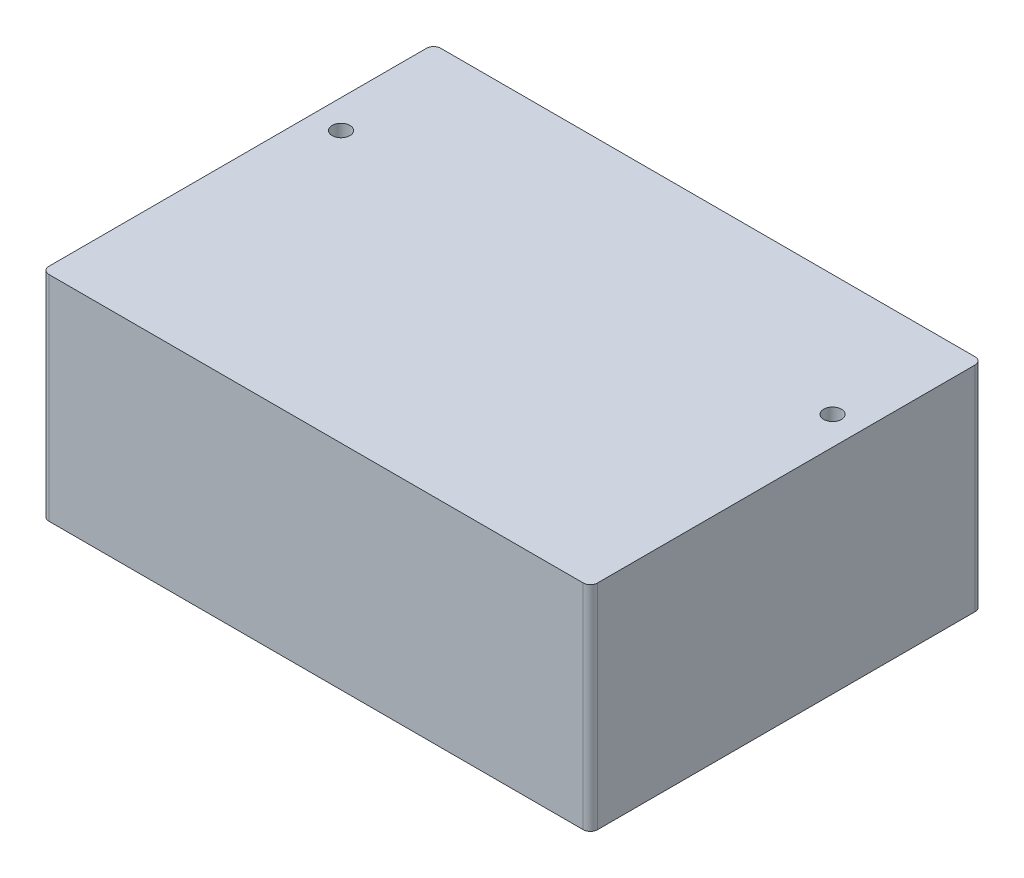
ISO-10303-21;
HEADER;
FILE_DESCRIPTION(('STEP AP214'),'2;1');
FILE_NAME('part.step','',(''),(''),'','','');
FILE_SCHEMA(('AUTOMOTIVE_DESIGN { 1 0 10303 214 1 1 1 1 }'));
ENDSEC;
DATA;
#1=APPLICATION_CONTEXT('core data for automotive mechanical design processes');
#2=APPLICATION_PROTOCOL_DEFINITION('international standard','automotive_design',2000,#1);
#3=PRODUCT_CONTEXT('',#1,'mechanical');
#4=PRODUCT('Part','Part','',(#3));
#5=PRODUCT_RELATED_PRODUCT_CATEGORY('part','',(#4));
#6=PRODUCT_DEFINITION_FORMATION('','',#4);
#7=PRODUCT_DEFINITION_CONTEXT('part definition',#1,'design');
#8=PRODUCT_DEFINITION('design','',#6,#7);
#9=PRODUCT_DEFINITION_SHAPE('','',#8);
#10=(LENGTH_UNIT() NAMED_UNIT(*) SI_UNIT(.MILLI.,.METRE.));
#11=(NAMED_UNIT(*) PLANE_ANGLE_UNIT() SI_UNIT($,.RADIAN.));
#12=(NAMED_UNIT(*) SI_UNIT($,.STERADIAN.) SOLID_ANGLE_UNIT());
#13=UNCERTAINTY_MEASURE_WITH_UNIT(LENGTH_MEASURE(1.E-05),#10,'distance_accuracy_value','');
#14=(GEOMETRIC_REPRESENTATION_CONTEXT(3) GLOBAL_UNCERTAINTY_ASSIGNED_CONTEXT((#13)) GLOBAL_UNIT_ASSIGNED_CONTEXT((#10,
#11,#12)) REPRESENTATION_CONTEXT('',''));
#15=CARTESIAN_POINT('',(0.,0.,0.));
#16=DIRECTION('',(0.,0.,1.));
#17=DIRECTION('',(1.,0.,0.));
#18=AXIS2_PLACEMENT_3D('',#15,#16,#17);
#19=CARTESIAN_POINT('',(0.,30.,0.));
#20=DIRECTION('',(1.,0.,0.));
#21=DIRECTION('',(0.,0.,-1.));
#22=AXIS2_PLACEMENT_3D('',#19,#20,#21);
#23=PLANE('',#22);
#24=DIRECTION('',(0.,0.,1.));
#25=VECTOR('',#24,1.);
#26=CARTESIAN_POINT('',(0.,30.,0.));
#27=LINE('',#26,#25);
#28=CARTESIAN_POINT('',(0.,30.,-54.));
#29=VERTEX_POINT('',#28);
#30=CARTESIAN_POINT('',(0.,30.,-1.));
#31=VERTEX_POINT('',#30);
#32=EDGE_CURVE('E172',#29,#31,#27,.T.);
#33=ORIENTED_EDGE('',*,*,#32,.F.);
#34=DIRECTION('',(0.,1.,0.));
#35=VECTOR('',#34,1.);
#36=CARTESIAN_POINT('',(0.,30.,-54.));
#37=LINE('',#36,#35);
#38=CARTESIAN_POINT('',(0.,0.,-54.));
#39=VERTEX_POINT('',#38);
#40=EDGE_CURVE('E66',#29,#39,#37,.F.);
#41=ORIENTED_EDGE('',*,*,#40,.T.);
#42=DIRECTION('',(0.,0.,1.));
#43=VECTOR('',#42,1.);
#44=CARTESIAN_POINT('',(0.,0.,0.));
#45=LINE('',#44,#43);
#46=CARTESIAN_POINT('',(0.,0.,-1.));
#47=VERTEX_POINT('',#46);
#48=EDGE_CURVE('E109',#39,#47,#45,.T.);
#49=ORIENTED_EDGE('',*,*,#48,.T.);
#50=DIRECTION('',(0.,-1.,0.));
#51=VECTOR('',#50,1.);
#52=CARTESIAN_POINT('',(0.,30.,-1.));
#53=LINE('',#52,#51);
#54=EDGE_CURVE('E112',#47,#31,#53,.F.);
#55=ORIENTED_EDGE('',*,*,#54,.T.);
#56=EDGE_LOOP('',(#33,#41,#49,#55));
#57=FACE_BOUND('',#56,.T.);
#58=ADVANCED_FACE('F43',(#57),#23,.F.);
#59=CARTESIAN_POINT('',(0.,30.,0.));
#60=DIRECTION('',(0.,0.,-1.));
#61=DIRECTION('',(-1.,0.,0.));
#62=AXIS2_PLACEMENT_3D('',#59,#60,#61);
#63=PLANE('',#62);
#64=DIRECTION('',(1.,0.,0.));
#65=VECTOR('',#64,1.);
#66=CARTESIAN_POINT('',(0.,0.,0.));
#67=LINE('',#66,#65);
#68=CARTESIAN_POINT('',(1.,0.,0.));
#69=VERTEX_POINT('',#68);
#70=CARTESIAN_POINT('',(76.,0.,0.));
#71=VERTEX_POINT('',#70);
#72=EDGE_CURVE('E115',#69,#71,#67,.T.);
#73=ORIENTED_EDGE('',*,*,#72,.T.);
#74=DIRECTION('',(0.,-1.,0.));
#75=VECTOR('',#74,1.);
#76=CARTESIAN_POINT('',(76.,30.,0.));
#77=LINE('',#76,#75);
#78=CARTESIAN_POINT('',(76.,30.,0.));
#79=VERTEX_POINT('',#78);
#80=EDGE_CURVE('E147',#71,#79,#77,.F.);
#81=ORIENTED_EDGE('',*,*,#80,.T.);
#82=DIRECTION('',(1.,0.,0.));
#83=VECTOR('',#82,1.);
#84=CARTESIAN_POINT('',(0.,30.,0.));
#85=LINE('',#84,#83);
#86=CARTESIAN_POINT('',(1.,30.,0.));
#87=VERTEX_POINT('',#86);
#88=EDGE_CURVE('E132',#87,#79,#85,.T.);
#89=ORIENTED_EDGE('',*,*,#88,.F.);
#90=DIRECTION('',(0.,-1.,0.));
#91=VECTOR('',#90,1.);
#92=CARTESIAN_POINT('',(1.,30.,0.));
#93=LINE('',#92,#91);
#94=EDGE_CURVE('E145',#87,#69,#93,.T.);
#95=ORIENTED_EDGE('',*,*,#94,.T.);
#96=EDGE_LOOP('',(#73,#81,#89,#95));
#97=FACE_BOUND('',#96,.T.);
#98=ADVANCED_FACE('F180',(#97),#63,.F.);
#99=CARTESIAN_POINT('',(77.,30.,0.));
#100=DIRECTION('',(-1.,0.,0.));
#101=DIRECTION('',(0.,0.,1.));
#102=AXIS2_PLACEMENT_3D('',#99,#100,#101);
#103=PLANE('',#102);
#104=DIRECTION('',(0.,0.,-1.));
#105=VECTOR('',#104,1.);
#106=CARTESIAN_POINT('',(77.,0.,0.));
#107=LINE('',#106,#105);
#108=CARTESIAN_POINT('',(77.,0.,-1.));
#109=VERTEX_POINT('',#108);
#110=CARTESIAN_POINT('',(77.,0.,-54.));
#111=VERTEX_POINT('',#110);
#112=EDGE_CURVE('E135',#109,#111,#107,.T.);
#113=ORIENTED_EDGE('',*,*,#112,.T.);
#114=DIRECTION('',(0.,1.,0.));
#115=VECTOR('',#114,1.);
#116=CARTESIAN_POINT('',(77.,30.,-54.));
#117=LINE('',#116,#115);
#118=CARTESIAN_POINT('',(77.,30.,-54.));
#119=VERTEX_POINT('',#118);
#120=EDGE_CURVE('E11',#111,#119,#117,.T.);
#121=ORIENTED_EDGE('',*,*,#120,.T.);
#122=DIRECTION('',(0.,0.,-1.));
#123=VECTOR('',#122,1.);
#124=CARTESIAN_POINT('',(77.,30.,0.));
#125=LINE('',#124,#123);
#126=CARTESIAN_POINT('',(77.,30.,-1.));
#127=VERTEX_POINT('',#126);
#128=EDGE_CURVE('E129',#127,#119,#125,.T.);
#129=ORIENTED_EDGE('',*,*,#128,.F.);
#130=DIRECTION('',(0.,-1.,0.));
#131=VECTOR('',#130,1.);
#132=CARTESIAN_POINT('',(77.,30.,-1.));
#133=LINE('',#132,#131);
#134=EDGE_CURVE('E142',#127,#109,#133,.T.);
#135=ORIENTED_EDGE('',*,*,#134,.T.);
#136=EDGE_LOOP('',(#113,#121,#129,#135));
#137=FACE_BOUND('',#136,.T.);
#138=ADVANCED_FACE('F188',(#137),#103,.F.);
#139=CARTESIAN_POINT('',(0.,30.,0.));
#140=DIRECTION('',(0.,-1.,0.));
#141=DIRECTION('',(0.,0.,-1.));
#142=AXIS2_PLACEMENT_3D('',#139,#140,#141);
#143=PLANE('',#142);
#144=CARTESIAN_POINT('',(73.0000000000001,30.,-38.));
#145=DIRECTION('',(0.,1.,0.));
#146=DIRECTION('',(0.,0.,1.));
#147=AXIS2_PLACEMENT_3D('',#144,#145,#146);
#148=CIRCLE('',#147,1.25);
#149=CARTESIAN_POINT('',(73.0000000000001,30.,-36.75));
#150=VERTEX_POINT('',#149);
#151=EDGE_CURVE('E212',#150,#150,#148,.T.);
#152=ORIENTED_EDGE('',*,*,#151,.F.);
#153=EDGE_LOOP('',(#152));
#154=FACE_BOUND('',#153,.T.);
#155=CARTESIAN_POINT('',(4.00000000000009,30.,-38.));
#156=DIRECTION('',(0.,1.,0.));
#157=DIRECTION('',(0.,0.,1.));
#158=AXIS2_PLACEMENT_3D('',#155,#156,#157);
#159=CIRCLE('',#158,1.25);
#160=CARTESIAN_POINT('',(4.00000000000009,30.,-36.75));
#161=VERTEX_POINT('',#160);
#162=EDGE_CURVE('E206',#161,#161,#159,.T.);
#163=ORIENTED_EDGE('',*,*,#162,.F.);
#164=EDGE_LOOP('',(#163));
#165=FACE_BOUND('',#164,.T.);
#166=DIRECTION('',(1.,0.,0.));
#167=VECTOR('',#166,1.);
#168=CARTESIAN_POINT('',(0.,30.,-55.));
#169=LINE('',#168,#167);
#170=CARTESIAN_POINT('',(1.,30.,-55.));
#171=VERTEX_POINT('',#170);
#172=CARTESIAN_POINT('',(76.,30.,-55.));
#173=VERTEX_POINT('',#172);
#174=EDGE_CURVE('E116',#171,#173,#169,.T.);
#175=ORIENTED_EDGE('',*,*,#174,.F.);
#176=CARTESIAN_POINT('',(1.,30.,-54.));
#177=DIRECTION('',(0.,-1.,0.));
#178=DIRECTION('',(0.,0.,-1.));
#179=AXIS2_PLACEMENT_3D('',#176,#177,#178);
#180=CIRCLE('',#179,1.);
#181=EDGE_CURVE('E159',#171,#29,#180,.F.);
#182=ORIENTED_EDGE('',*,*,#181,.T.);
#183=ORIENTED_EDGE('',*,*,#32,.T.);
#184=CARTESIAN_POINT('',(1.,30.,-1.));
#185=DIRECTION('',(0.,-1.,0.));
#186=DIRECTION('',(0.,0.,-1.));
#187=AXIS2_PLACEMENT_3D('',#184,#185,#186);
#188=CIRCLE('',#187,1.);
#189=EDGE_CURVE('E128',#31,#87,#188,.F.);
#190=ORIENTED_EDGE('',*,*,#189,.T.);
#191=ORIENTED_EDGE('',*,*,#88,.T.);
#192=CARTESIAN_POINT('',(76.,30.,-1.));
#193=DIRECTION('',(0.,-1.,0.));
#194=DIRECTION('',(0.,0.,-1.));
#195=AXIS2_PLACEMENT_3D('',#192,#193,#194);
#196=CIRCLE('',#195,1.);
#197=EDGE_CURVE('E140',#79,#127,#196,.F.);
#198=ORIENTED_EDGE('',*,*,#197,.T.);
#199=ORIENTED_EDGE('',*,*,#128,.T.);
#200=CARTESIAN_POINT('',(76.,30.,-54.));
#201=DIRECTION('',(0.,-1.,0.));
#202=DIRECTION('',(0.,0.,-1.));
#203=AXIS2_PLACEMENT_3D('',#200,#201,#202);
#204=CIRCLE('',#203,1.);
#205=EDGE_CURVE('E157',#119,#173,#204,.F.);
#206=ORIENTED_EDGE('',*,*,#205,.T.);
#207=EDGE_LOOP('',(#175,#182,#183,#190,#191,#198,#199,#206));
#208=FACE_BOUND('',#207,.T.);
#209=ADVANCED_FACE('F171',(#154,#165,#208),#143,.F.);
#210=CARTESIAN_POINT('',(0.,0.,0.));
#211=DIRECTION('',(0.,-1.,0.));
#212=DIRECTION('',(0.,0.,-1.));
#213=AXIS2_PLACEMENT_3D('',#210,#211,#212);
#214=PLANE('',#213);
#215=CARTESIAN_POINT('',(3.99999999999992,0.,-17.515605611186));
#216=DIRECTION('',(0.,-1.,0.));
#217=DIRECTION('',(0.,0.,-1.));
#218=AXIS2_PLACEMENT_3D('',#215,#216,#217);
#219=CIRCLE('',#218,1.25);
#220=CARTESIAN_POINT('',(3.99999999999992,0.,-18.765605611186));
#221=VERTEX_POINT('',#220);
#222=EDGE_CURVE('E200',#221,#221,#219,.T.);
#223=ORIENTED_EDGE('',*,*,#222,.F.);
#224=EDGE_LOOP('',(#223));
#225=FACE_BOUND('',#224,.T.);
#226=CARTESIAN_POINT('',(73.,0.,-17.515605611186));
#227=DIRECTION('',(0.,-1.,0.));
#228=DIRECTION('',(0.,0.,-1.));
#229=AXIS2_PLACEMENT_3D('',#226,#227,#228);
#230=CIRCLE('',#229,1.25);
#231=CARTESIAN_POINT('',(73.,0.,-18.765605611186));
#232=VERTEX_POINT('',#231);
#233=EDGE_CURVE('E193',#232,#232,#230,.T.);
#234=ORIENTED_EDGE('',*,*,#233,.F.);
#235=EDGE_LOOP('',(#234));
#236=FACE_BOUND('',#235,.T.);
#237=ORIENTED_EDGE('',*,*,#48,.F.);
#238=CARTESIAN_POINT('',(1.,0.,-54.));
#239=DIRECTION('',(0.,-1.,0.));
#240=DIRECTION('',(0.,0.,-1.));
#241=AXIS2_PLACEMENT_3D('',#238,#239,#240);
#242=CIRCLE('',#241,1.);
#243=CARTESIAN_POINT('',(1.,0.,-55.));
#244=VERTEX_POINT('',#243);
#245=EDGE_CURVE('E51',#39,#244,#242,.T.);
#246=ORIENTED_EDGE('',*,*,#245,.T.);
#247=DIRECTION('',(-1.,0.,0.));
#248=VECTOR('',#247,1.);
#249=CARTESIAN_POINT('',(0.,0.,-55.));
#250=LINE('',#249,#248);
#251=CARTESIAN_POINT('',(76.,0.,-55.));
#252=VERTEX_POINT('',#251);
#253=EDGE_CURVE('E149',#252,#244,#250,.T.);
#254=ORIENTED_EDGE('',*,*,#253,.F.);
#255=CARTESIAN_POINT('',(76.,0.,-54.));
#256=DIRECTION('',(0.,-1.,0.));
#257=DIRECTION('',(0.,0.,-1.));
#258=AXIS2_PLACEMENT_3D('',#255,#256,#257);
#259=CIRCLE('',#258,1.);
#260=EDGE_CURVE('E58',#252,#111,#259,.T.);
#261=ORIENTED_EDGE('',*,*,#260,.T.);
#262=ORIENTED_EDGE('',*,*,#112,.F.);
#263=CARTESIAN_POINT('',(76.,0.,-1.));
#264=DIRECTION('',(0.,-1.,0.));
#265=DIRECTION('',(0.,0.,-1.));
#266=AXIS2_PLACEMENT_3D('',#263,#264,#265);
#267=CIRCLE('',#266,1.);
#268=EDGE_CURVE('E125',#109,#71,#267,.T.);
#269=ORIENTED_EDGE('',*,*,#268,.T.);
#270=ORIENTED_EDGE('',*,*,#72,.F.);
#271=CARTESIAN_POINT('',(1.,0.,-1.));
#272=DIRECTION('',(0.,-1.,0.));
#273=DIRECTION('',(0.,0.,-1.));
#274=AXIS2_PLACEMENT_3D('',#271,#272,#273);
#275=CIRCLE('',#274,1.);
#276=EDGE_CURVE('E119',#69,#47,#275,.T.);
#277=ORIENTED_EDGE('',*,*,#276,.T.);
#278=EDGE_LOOP('',(#237,#246,#254,#261,#262,#269,#270,#277));
#279=FACE_BOUND('',#278,.T.);
#280=ADVANCED_FACE('F120',(#225,#236,#279),#214,.T.);
#281=CARTESIAN_POINT('',(76.,30.,-1.));
#282=DIRECTION('',(0.,-1.,0.));
#283=DIRECTION('',(0.,0.,-1.));
#284=AXIS2_PLACEMENT_3D('',#281,#282,#283);
#285=CYLINDRICAL_SURFACE('',#284,1.);
#286=ORIENTED_EDGE('',*,*,#197,.F.);
#287=ORIENTED_EDGE('',*,*,#80,.F.);
#288=ORIENTED_EDGE('',*,*,#268,.F.);
#289=ORIENTED_EDGE('',*,*,#134,.F.);
#290=EDGE_LOOP('',(#286,#287,#288,#289));
#291=FACE_BOUND('',#290,.T.);
#292=ADVANCED_FACE('F184',(#291),#285,.T.);
#293=CARTESIAN_POINT('',(1.,30.,-1.));
#294=DIRECTION('',(0.,-1.,0.));
#295=DIRECTION('',(0.,0.,-1.));
#296=AXIS2_PLACEMENT_3D('',#293,#294,#295);
#297=CYLINDRICAL_SURFACE('',#296,1.);
#298=ORIENTED_EDGE('',*,*,#189,.F.);
#299=ORIENTED_EDGE('',*,*,#54,.F.);
#300=ORIENTED_EDGE('',*,*,#276,.F.);
#301=ORIENTED_EDGE('',*,*,#94,.F.);
#302=EDGE_LOOP('',(#298,#299,#300,#301));
#303=FACE_BOUND('',#302,.T.);
#304=ADVANCED_FACE('F127',(#303),#297,.T.);
#305=CARTESIAN_POINT('',(0.,-10.,-55.));
#306=DIRECTION('',(0.,0.,1.));
#307=DIRECTION('',(1.,0.,0.));
#308=AXIS2_PLACEMENT_3D('',#305,#306,#307);
#309=PLANE('',#308);
#310=ORIENTED_EDGE('',*,*,#253,.T.);
#311=DIRECTION('',(0.,1.,0.));
#312=VECTOR('',#311,1.);
#313=CARTESIAN_POINT('',(1.,-10.,-55.));
#314=LINE('',#313,#312);
#315=EDGE_CURVE('E154',#244,#171,#314,.T.);
#316=ORIENTED_EDGE('',*,*,#315,.T.);
#317=ORIENTED_EDGE('',*,*,#174,.T.);
#318=DIRECTION('',(0.,1.,0.));
#319=VECTOR('',#318,1.);
#320=CARTESIAN_POINT('',(76.,-10.,-55.));
#321=LINE('',#320,#319);
#322=EDGE_CURVE('E152',#173,#252,#321,.F.);
#323=ORIENTED_EDGE('',*,*,#322,.T.);
#324=EDGE_LOOP('',(#310,#316,#317,#323));
#325=FACE_BOUND('',#324,.T.);
#326=ADVANCED_FACE('F165',(#325),#309,.F.);
#327=CARTESIAN_POINT('',(1.,-10.,-54.));
#328=DIRECTION('',(0.,1.,0.));
#329=DIRECTION('',(0.,0.,1.));
#330=AXIS2_PLACEMENT_3D('',#327,#328,#329);
#331=CYLINDRICAL_SURFACE('',#330,1.);
#332=ORIENTED_EDGE('',*,*,#245,.F.);
#333=ORIENTED_EDGE('',*,*,#40,.F.);
#334=ORIENTED_EDGE('',*,*,#181,.F.);
#335=ORIENTED_EDGE('',*,*,#315,.F.);
#336=EDGE_LOOP('',(#332,#333,#334,#335));
#337=FACE_BOUND('',#336,.T.);
#338=ADVANCED_FACE('F169',(#337),#331,.T.);
#339=CARTESIAN_POINT('',(76.,30.,-54.));
#340=DIRECTION('',(0.,1.,0.));
#341=DIRECTION('',(0.,0.,1.));
#342=AXIS2_PLACEMENT_3D('',#339,#340,#341);
#343=CYLINDRICAL_SURFACE('',#342,1.);
#344=ORIENTED_EDGE('',*,*,#260,.F.);
#345=ORIENTED_EDGE('',*,*,#322,.F.);
#346=ORIENTED_EDGE('',*,*,#205,.F.);
#347=ORIENTED_EDGE('',*,*,#120,.F.);
#348=EDGE_LOOP('',(#344,#345,#346,#347));
#349=FACE_BOUND('',#348,.T.);
#350=ADVANCED_FACE('F45',(#349),#343,.T.);
#351=CARTESIAN_POINT('',(73.,5.,-17.515605611186));
#352=DIRECTION('',(0.,-1.,0.));
#353=DIRECTION('',(0.,0.,-1.));
#354=AXIS2_PLACEMENT_3D('',#351,#352,#353);
#355=CYLINDRICAL_SURFACE('',#354,1.25);
#356=CARTESIAN_POINT('',(73.,5.,-17.515605611186));
#357=DIRECTION('',(0.,-1.,0.));
#358=DIRECTION('',(0.,0.,-1.));
#359=AXIS2_PLACEMENT_3D('',#356,#357,#358);
#360=CIRCLE('',#359,1.25);
#361=CARTESIAN_POINT('',(73.,5.,-18.765605611186));
#362=VERTEX_POINT('',#361);
#363=EDGE_CURVE('E191',#362,#362,#360,.T.);
#364=ORIENTED_EDGE('',*,*,#363,.F.);
#365=EDGE_LOOP('',(#364));
#366=FACE_BOUND('',#365,.T.);
#367=ORIENTED_EDGE('',*,*,#233,.T.);
#368=EDGE_LOOP('',(#367));
#369=FACE_BOUND('',#368,.T.);
#370=ADVANCED_FACE('F265',(#366,#369),#355,.F.);
#371=CARTESIAN_POINT('',(73.,5.,-17.515605611186));
#372=DIRECTION('',(0.,-1.,0.));
#373=DIRECTION('',(0.,0.,-1.));
#374=AXIS2_PLACEMENT_3D('',#371,#372,#373);
#375=PLANE('',#374);
#376=ORIENTED_EDGE('',*,*,#363,.T.);
#377=EDGE_LOOP('',(#376));
#378=FACE_BOUND('',#377,.T.);
#379=ADVANCED_FACE('F300',(#378),#375,.T.);
#380=CARTESIAN_POINT('',(3.99999999999992,5.,-17.515605611186));
#381=DIRECTION('',(0.,-1.,0.));
#382=DIRECTION('',(0.,0.,-1.));
#383=AXIS2_PLACEMENT_3D('',#380,#381,#382);
#384=CYLINDRICAL_SURFACE('',#383,1.25);
#385=CARTESIAN_POINT('',(3.99999999999992,5.,-17.515605611186));
#386=DIRECTION('',(0.,-1.,0.));
#387=DIRECTION('',(0.,0.,-1.));
#388=AXIS2_PLACEMENT_3D('',#385,#386,#387);
#389=CIRCLE('',#388,1.25);
#390=CARTESIAN_POINT('',(3.99999999999992,5.,-18.765605611186));
#391=VERTEX_POINT('',#390);
#392=EDGE_CURVE('E198',#391,#391,#389,.T.);
#393=ORIENTED_EDGE('',*,*,#392,.F.);
#394=EDGE_LOOP('',(#393));
#395=FACE_BOUND('',#394,.T.);
#396=ORIENTED_EDGE('',*,*,#222,.T.);
#397=EDGE_LOOP('',(#396));
#398=FACE_BOUND('',#397,.T.);
#399=ADVANCED_FACE('F243',(#395,#398),#384,.F.);
#400=CARTESIAN_POINT('',(3.99999999999992,5.,-17.515605611186));
#401=DIRECTION('',(0.,-1.,0.));
#402=DIRECTION('',(0.,0.,-1.));
#403=AXIS2_PLACEMENT_3D('',#400,#401,#402);
#404=PLANE('',#403);
#405=ORIENTED_EDGE('',*,*,#392,.T.);
#406=EDGE_LOOP('',(#405));
#407=FACE_BOUND('',#406,.T.);
#408=ADVANCED_FACE('F234',(#407),#404,.T.);
#409=CARTESIAN_POINT('',(4.00000000000009,25.,-38.));
#410=DIRECTION('',(0.,1.,0.));
#411=DIRECTION('',(0.,0.,1.));
#412=AXIS2_PLACEMENT_3D('',#409,#410,#411);
#413=CYLINDRICAL_SURFACE('',#412,1.25);
#414=CARTESIAN_POINT('',(4.00000000000009,25.,-38.));
#415=DIRECTION('',(0.,1.,0.));
#416=DIRECTION('',(0.,0.,1.));
#417=AXIS2_PLACEMENT_3D('',#414,#415,#416);
#418=CIRCLE('',#417,1.25);
#419=CARTESIAN_POINT('',(4.00000000000009,25.,-36.75));
#420=VERTEX_POINT('',#419);
#421=EDGE_CURVE('E209',#420,#420,#418,.T.);
#422=ORIENTED_EDGE('',*,*,#421,.F.);
#423=EDGE_LOOP('',(#422));
#424=FACE_BOUND('',#423,.T.);
#425=ORIENTED_EDGE('',*,*,#162,.T.);
#426=EDGE_LOOP('',(#425));
#427=FACE_BOUND('',#426,.T.);
#428=ADVANCED_FACE('F232',(#424,#427),#413,.F.);
#429=CARTESIAN_POINT('',(4.00000000000009,25.,-38.));
#430=DIRECTION('',(0.,1.,0.));
#431=DIRECTION('',(0.,0.,1.));
#432=AXIS2_PLACEMENT_3D('',#429,#430,#431);
#433=PLANE('',#432);
#434=ORIENTED_EDGE('',*,*,#421,.T.);
#435=EDGE_LOOP('',(#434));
#436=FACE_BOUND('',#435,.T.);
#437=ADVANCED_FACE('F223',(#436),#433,.T.);
#438=CARTESIAN_POINT('',(73.0000000000001,25.,-38.));
#439=DIRECTION('',(0.,1.,0.));
#440=DIRECTION('',(0.,0.,1.));
#441=AXIS2_PLACEMENT_3D('',#438,#439,#440);
#442=CYLINDRICAL_SURFACE('',#441,1.25);
#443=CARTESIAN_POINT('',(73.0000000000001,25.,-38.));
#444=DIRECTION('',(0.,1.,0.));
#445=DIRECTION('',(0.,0.,1.));
#446=AXIS2_PLACEMENT_3D('',#443,#444,#445);
#447=CIRCLE('',#446,1.25);
#448=CARTESIAN_POINT('',(73.0000000000001,25.,-36.75));
#449=VERTEX_POINT('',#448);
#450=EDGE_CURVE('E203',#449,#449,#447,.T.);
#451=ORIENTED_EDGE('',*,*,#450,.F.);
#452=EDGE_LOOP('',(#451));
#453=FACE_BOUND('',#452,.T.);
#454=ORIENTED_EDGE('',*,*,#151,.T.);
#455=EDGE_LOOP('',(#454));
#456=FACE_BOUND('',#455,.T.);
#457=ADVANCED_FACE('F220',(#453,#456),#442,.F.);
#458=CARTESIAN_POINT('',(73.0000000000001,25.,-38.));
#459=DIRECTION('',(0.,1.,0.));
#460=DIRECTION('',(0.,0.,1.));
#461=AXIS2_PLACEMENT_3D('',#458,#459,#460);
#462=PLANE('',#461);
#463=ORIENTED_EDGE('',*,*,#450,.T.);
#464=EDGE_LOOP('',(#463));
#465=FACE_BOUND('',#464,.T.);
#466=ADVANCED_FACE('F218',(#465),#462,.T.);
#467=CLOSED_SHELL('',(#58,#98,#138,#209,#280,#292,#304,#326,#338,#350,#370,#379,#399,#408,#428,
#437,#457,#466));
#468=MANIFOLD_SOLID_BREP('B2',#467);
#469=ADVANCED_BREP_SHAPE_REPRESENTATION('',(#18,#468),#14);
#470=SHAPE_DEFINITION_REPRESENTATION(#9,#469);
ENDSEC;
END-ISO-10303-21;
